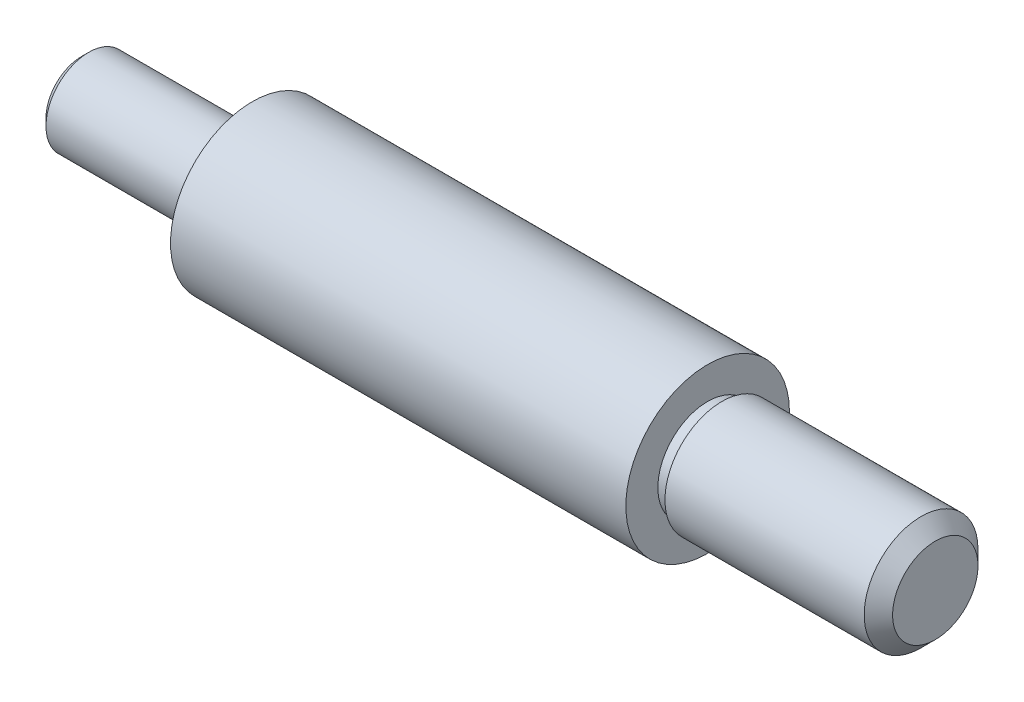
ISO-10303-21;
HEADER;
FILE_DESCRIPTION(('STEP AP214'),'2;1');
FILE_NAME('part.step','',(''),(''),'','','');
FILE_SCHEMA(('AUTOMOTIVE_DESIGN { 1 0 10303 214 1 1 1 1 }'));
ENDSEC;
DATA;
#1=APPLICATION_CONTEXT('core data for automotive mechanical design processes');
#2=APPLICATION_PROTOCOL_DEFINITION('international standard','automotive_design',2000,#1);
#3=PRODUCT_CONTEXT('',#1,'mechanical');
#4=PRODUCT('Part','Part','',(#3));
#5=PRODUCT_RELATED_PRODUCT_CATEGORY('part','',(#4));
#6=PRODUCT_DEFINITION_FORMATION('','',#4);
#7=PRODUCT_DEFINITION_CONTEXT('part definition',#1,'design');
#8=PRODUCT_DEFINITION('design','',#6,#7);
#9=PRODUCT_DEFINITION_SHAPE('','',#8);
#10=(LENGTH_UNIT() NAMED_UNIT(*) SI_UNIT(.MILLI.,.METRE.));
#11=(NAMED_UNIT(*) PLANE_ANGLE_UNIT() SI_UNIT($,.RADIAN.));
#12=(NAMED_UNIT(*) SI_UNIT($,.STERADIAN.) SOLID_ANGLE_UNIT());
#13=UNCERTAINTY_MEASURE_WITH_UNIT(LENGTH_MEASURE(1.E-05),#10,'distance_accuracy_value','');
#14=(GEOMETRIC_REPRESENTATION_CONTEXT(3) GLOBAL_UNCERTAINTY_ASSIGNED_CONTEXT((#13)) GLOBAL_UNIT_ASSIGNED_CONTEXT((#10,
#11,#12)) REPRESENTATION_CONTEXT('',''));
#15=CARTESIAN_POINT('',(0.,0.,0.));
#16=DIRECTION('',(0.,0.,1.));
#17=DIRECTION('',(1.,0.,0.));
#18=AXIS2_PLACEMENT_3D('',#15,#16,#17);
#19=CARTESIAN_POINT('',(30.,0.,0.));
#20=DIRECTION('',(1.,0.,0.));
#21=DIRECTION('',(0.,0.,-1.));
#22=AXIS2_PLACEMENT_3D('',#19,#20,#21);
#23=PLANE('',#22);
#24=CARTESIAN_POINT('',(30.,0.,0.));
#25=DIRECTION('',(1.,0.,0.));
#26=DIRECTION('',(0.,0.,-1.));
#27=AXIS2_PLACEMENT_3D('',#24,#25,#26);
#28=CIRCLE('',#27,5.99999999999998);
#29=CARTESIAN_POINT('',(30.,0.,-5.99999999999998));
#30=VERTEX_POINT('',#29);
#31=EDGE_CURVE('E46',#30,#30,#28,.T.);
#32=ORIENTED_EDGE('',*,*,#31,.T.);
#33=EDGE_LOOP('',(#32));
#34=FACE_BOUND('',#33,.T.);
#35=ADVANCED_FACE('F31',(#34),#23,.T.);
#36=CARTESIAN_POINT('',(-90.,0.,0.));
#37=DIRECTION('',(-1.,0.,0.));
#38=DIRECTION('',(0.,0.,1.));
#39=AXIS2_PLACEMENT_3D('',#36,#37,#38);
#40=PLANE('',#39);
#41=CARTESIAN_POINT('',(-90.,0.,0.));
#42=DIRECTION('',(-1.,0.,0.));
#43=DIRECTION('',(0.,0.,1.));
#44=AXIS2_PLACEMENT_3D('',#41,#42,#43);
#45=CIRCLE('',#44,5.00000000000002);
#46=CARTESIAN_POINT('',(-90.,0.,5.00000000000002));
#47=VERTEX_POINT('',#46);
#48=EDGE_CURVE('E10',#47,#47,#45,.T.);
#49=ORIENTED_EDGE('',*,*,#48,.T.);
#50=EDGE_LOOP('',(#49));
#51=FACE_BOUND('',#50,.T.);
#52=ADVANCED_FACE('F94',(#51),#40,.T.);
#53=CARTESIAN_POINT('',(-68.,0.,0.));
#54=DIRECTION('',(1.,0.,0.));
#55=DIRECTION('',(0.,0.,-1.));
#56=AXIS2_PLACEMENT_3D('',#53,#54,#55);
#57=CYLINDRICAL_SURFACE('',#56,6.);
#58=CARTESIAN_POINT('',(-89.,0.,0.));
#59=DIRECTION('',(-1.,0.,0.));
#60=DIRECTION('',(0.,0.,1.));
#61=AXIS2_PLACEMENT_3D('',#58,#59,#60);
#62=CIRCLE('',#61,6.);
#63=CARTESIAN_POINT('',(-89.,0.,6.));
#64=VERTEX_POINT('',#63);
#65=EDGE_CURVE('E38',#64,#64,#62,.F.);
#66=ORIENTED_EDGE('',*,*,#65,.T.);
#67=EDGE_LOOP('',(#66));
#68=FACE_BOUND('',#67,.T.);
#69=CARTESIAN_POINT('',(-68.,0.,0.));
#70=DIRECTION('',(1.,0.,0.));
#71=DIRECTION('',(0.,0.,-1.));
#72=AXIS2_PLACEMENT_3D('',#69,#70,#71);
#73=CIRCLE('',#72,6.);
#74=CARTESIAN_POINT('',(-68.,0.,-6.));
#75=VERTEX_POINT('',#74);
#76=EDGE_CURVE('E51',#75,#75,#73,.T.);
#77=ORIENTED_EDGE('',*,*,#76,.F.);
#78=EDGE_LOOP('',(#77));
#79=FACE_BOUND('',#78,.T.);
#80=ADVANCED_FACE('F100',(#68,#79),#57,.T.);
#81=CARTESIAN_POINT('',(-68.,5.,0.));
#82=DIRECTION('',(1.,0.,0.));
#83=DIRECTION('',(0.,0.,-1.));
#84=AXIS2_PLACEMENT_3D('',#81,#82,#83);
#85=PLANE('',#84);
#86=ORIENTED_EDGE('',*,*,#76,.T.);
#87=EDGE_LOOP('',(#86));
#88=FACE_BOUND('',#87,.T.);
#89=CARTESIAN_POINT('',(-68.,0.,0.));
#90=DIRECTION('',(1.,0.,0.));
#91=DIRECTION('',(0.,0.,-1.));
#92=AXIS2_PLACEMENT_3D('',#89,#90,#91);
#93=CIRCLE('',#92,5.);
#94=CARTESIAN_POINT('',(-68.,0.,-5.));
#95=VERTEX_POINT('',#94);
#96=EDGE_CURVE('E54',#95,#95,#93,.T.);
#97=ORIENTED_EDGE('',*,*,#96,.F.);
#98=EDGE_LOOP('',(#97));
#99=FACE_BOUND('',#98,.T.);
#100=ADVANCED_FACE('F125',(#88,#99),#85,.T.);
#101=CARTESIAN_POINT('',(-68.,0.,0.));
#102=DIRECTION('',(1.,0.,0.));
#103=DIRECTION('',(0.,0.,-1.));
#104=AXIS2_PLACEMENT_3D('',#101,#102,#103);
#105=CYLINDRICAL_SURFACE('',#104,5.);
#106=ORIENTED_EDGE('',*,*,#96,.T.);
#107=EDGE_LOOP('',(#106));
#108=FACE_BOUND('',#107,.T.);
#109=CARTESIAN_POINT('',(-66.,0.,0.));
#110=DIRECTION('',(1.,0.,0.));
#111=DIRECTION('',(0.,0.,-1.));
#112=AXIS2_PLACEMENT_3D('',#109,#110,#111);
#113=CIRCLE('',#112,5.);
#114=CARTESIAN_POINT('',(-66.,0.,-5.));
#115=VERTEX_POINT('',#114);
#116=EDGE_CURVE('E57',#115,#115,#113,.T.);
#117=ORIENTED_EDGE('',*,*,#116,.F.);
#118=EDGE_LOOP('',(#117));
#119=FACE_BOUND('',#118,.T.);
#120=ADVANCED_FACE('F184',(#108,#119),#105,.T.);
#121=CARTESIAN_POINT('',(-66.,5.,0.));
#122=DIRECTION('',(-1.,0.,0.));
#123=DIRECTION('',(0.,0.,1.));
#124=AXIS2_PLACEMENT_3D('',#121,#122,#123);
#125=PLANE('',#124);
#126=ORIENTED_EDGE('',*,*,#116,.T.);
#127=EDGE_LOOP('',(#126));
#128=FACE_BOUND('',#127,.T.);
#129=CARTESIAN_POINT('',(-66.,0.,0.));
#130=DIRECTION('',(1.,0.,0.));
#131=DIRECTION('',(0.,0.,-1.));
#132=AXIS2_PLACEMENT_3D('',#129,#130,#131);
#133=CIRCLE('',#132,11.5);
#134=CARTESIAN_POINT('',(-66.,0.,-11.5));
#135=VERTEX_POINT('',#134);
#136=EDGE_CURVE('E60',#135,#135,#133,.T.);
#137=ORIENTED_EDGE('',*,*,#136,.F.);
#138=EDGE_LOOP('',(#137));
#139=FACE_BOUND('',#138,.T.);
#140=ADVANCED_FACE('F174',(#128,#139),#125,.T.);
#141=CARTESIAN_POINT('',(-68.,0.,0.));
#142=DIRECTION('',(1.,0.,0.));
#143=DIRECTION('',(0.,0.,-1.));
#144=AXIS2_PLACEMENT_3D('',#141,#142,#143);
#145=CYLINDRICAL_SURFACE('',#144,11.5);
#146=ORIENTED_EDGE('',*,*,#136,.T.);
#147=EDGE_LOOP('',(#146));
#148=FACE_BOUND('',#147,.T.);
#149=CARTESIAN_POINT('',(-2.,0.,0.));
#150=DIRECTION('',(1.,0.,0.));
#151=DIRECTION('',(0.,0.,-1.));
#152=AXIS2_PLACEMENT_3D('',#149,#150,#151);
#153=CIRCLE('',#152,11.5);
#154=CARTESIAN_POINT('',(-2.,0.,-11.5));
#155=VERTEX_POINT('',#154);
#156=EDGE_CURVE('E63',#155,#155,#153,.T.);
#157=ORIENTED_EDGE('',*,*,#156,.F.);
#158=EDGE_LOOP('',(#157));
#159=FACE_BOUND('',#158,.T.);
#160=ADVANCED_FACE('F164',(#148,#159),#145,.T.);
#161=CARTESIAN_POINT('',(-2.,7.,0.));
#162=DIRECTION('',(1.,0.,0.));
#163=DIRECTION('',(0.,0.,-1.));
#164=AXIS2_PLACEMENT_3D('',#161,#162,#163);
#165=PLANE('',#164);
#166=ORIENTED_EDGE('',*,*,#156,.T.);
#167=EDGE_LOOP('',(#166));
#168=FACE_BOUND('',#167,.T.);
#169=CARTESIAN_POINT('',(-2.,0.,0.));
#170=DIRECTION('',(1.,0.,0.));
#171=DIRECTION('',(0.,0.,-1.));
#172=AXIS2_PLACEMENT_3D('',#169,#170,#171);
#173=CIRCLE('',#172,7.);
#174=CARTESIAN_POINT('',(-2.,0.,-7.));
#175=VERTEX_POINT('',#174);
#176=EDGE_CURVE('E66',#175,#175,#173,.T.);
#177=ORIENTED_EDGE('',*,*,#176,.F.);
#178=EDGE_LOOP('',(#177));
#179=FACE_BOUND('',#178,.T.);
#180=ADVANCED_FACE('F90',(#168,#179),#165,.T.);
#181=CARTESIAN_POINT('',(-68.,0.,0.));
#182=DIRECTION('',(1.,0.,0.));
#183=DIRECTION('',(0.,0.,-1.));
#184=AXIS2_PLACEMENT_3D('',#181,#182,#183);
#185=CYLINDRICAL_SURFACE('',#184,7.);
#186=ORIENTED_EDGE('',*,*,#176,.T.);
#187=EDGE_LOOP('',(#186));
#188=FACE_BOUND('',#187,.T.);
#189=CARTESIAN_POINT('',(0.,0.,0.));
#190=DIRECTION('',(1.,0.,0.));
#191=DIRECTION('',(0.,0.,-1.));
#192=AXIS2_PLACEMENT_3D('',#189,#190,#191);
#193=CIRCLE('',#192,7.);
#194=CARTESIAN_POINT('',(0.,0.,-7.));
#195=VERTEX_POINT('',#194);
#196=EDGE_CURVE('E69',#195,#195,#193,.T.);
#197=ORIENTED_EDGE('',*,*,#196,.F.);
#198=EDGE_LOOP('',(#197));
#199=FACE_BOUND('',#198,.T.);
#200=ADVANCED_FACE('F80',(#188,#199),#185,.T.);
#201=CARTESIAN_POINT('',(0.,7.,0.));
#202=DIRECTION('',(-1.,0.,0.));
#203=DIRECTION('',(0.,0.,1.));
#204=AXIS2_PLACEMENT_3D('',#201,#202,#203);
#205=PLANE('',#204);
#206=ORIENTED_EDGE('',*,*,#196,.T.);
#207=EDGE_LOOP('',(#206));
#208=FACE_BOUND('',#207,.T.);
#209=CARTESIAN_POINT('',(0.,0.,0.));
#210=DIRECTION('',(1.,0.,0.));
#211=DIRECTION('',(0.,0.,-1.));
#212=AXIS2_PLACEMENT_3D('',#209,#210,#211);
#213=CIRCLE('',#212,8.);
#214=CARTESIAN_POINT('',(0.,0.,-8.));
#215=VERTEX_POINT('',#214);
#216=EDGE_CURVE('E72',#215,#215,#213,.T.);
#217=ORIENTED_EDGE('',*,*,#216,.F.);
#218=EDGE_LOOP('',(#217));
#219=FACE_BOUND('',#218,.T.);
#220=ADVANCED_FACE('F78',(#208,#219),#205,.T.);
#221=CARTESIAN_POINT('',(-68.,0.,0.));
#222=DIRECTION('',(1.,0.,0.));
#223=DIRECTION('',(0.,0.,-1.));
#224=AXIS2_PLACEMENT_3D('',#221,#222,#223);
#225=CYLINDRICAL_SURFACE('',#224,8.);
#226=CARTESIAN_POINT('',(28.,0.,0.));
#227=DIRECTION('',(1.,0.,0.));
#228=DIRECTION('',(0.,0.,-1.));
#229=AXIS2_PLACEMENT_3D('',#226,#227,#228);
#230=CIRCLE('',#229,8.);
#231=CARTESIAN_POINT('',(28.,0.,-8.));
#232=VERTEX_POINT('',#231);
#233=EDGE_CURVE('E42',#232,#232,#230,.F.);
#234=ORIENTED_EDGE('',*,*,#233,.T.);
#235=EDGE_LOOP('',(#234));
#236=FACE_BOUND('',#235,.T.);
#237=ORIENTED_EDGE('',*,*,#216,.T.);
#238=EDGE_LOOP('',(#237));
#239=FACE_BOUND('',#238,.T.);
#240=ADVANCED_FACE('F76',(#236,#239),#225,.T.);
#241=CARTESIAN_POINT('',(30.,0.,0.));
#242=DIRECTION('',(-1.,0.,0.));
#243=DIRECTION('',(0.,0.,1.));
#244=AXIS2_PLACEMENT_3D('',#241,#242,#243);
#245=CONICAL_SURFACE('',#244,5.99999999999998,0.785398163397447);
#246=ORIENTED_EDGE('',*,*,#233,.F.);
#247=EDGE_LOOP('',(#246));
#248=FACE_BOUND('',#247,.T.);
#249=ORIENTED_EDGE('',*,*,#31,.F.);
#250=EDGE_LOOP('',(#249));
#251=FACE_BOUND('',#250,.T.);
#252=ADVANCED_FACE('F87',(#248,#251),#245,.T.);
#253=CARTESIAN_POINT('',(-89.,0.,0.));
#254=DIRECTION('',(1.,0.,0.));
#255=DIRECTION('',(0.,0.,-1.));
#256=AXIS2_PLACEMENT_3D('',#253,#254,#255);
#257=CONICAL_SURFACE('',#256,6.,0.785398163397453);
#258=ORIENTED_EDGE('',*,*,#48,.F.);
#259=EDGE_LOOP('',(#258));
#260=FACE_BOUND('',#259,.T.);
#261=ORIENTED_EDGE('',*,*,#65,.F.);
#262=EDGE_LOOP('',(#261));
#263=FACE_BOUND('',#262,.T.);
#264=ADVANCED_FACE('F33',(#260,#263),#257,.T.);
#265=CLOSED_SHELL('',(#35,#52,#80,#100,#120,#140,#160,#180,#200,#220,#240,#252,#264));
#266=MANIFOLD_SOLID_BREP('B2',#265);
#267=ADVANCED_BREP_SHAPE_REPRESENTATION('',(#18,#266),#14);
#268=SHAPE_DEFINITION_REPRESENTATION(#9,#267);
ENDSEC;
END-ISO-10303-21;
